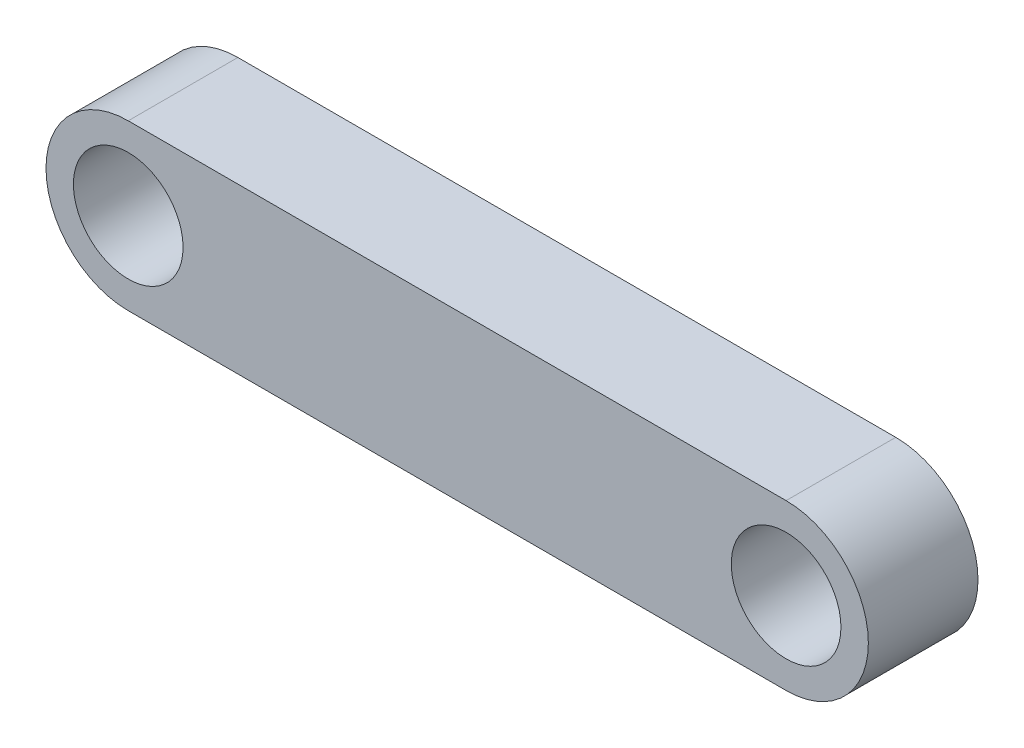
ISO-10303-21;
HEADER;
FILE_DESCRIPTION(('STEP AP214'),'2;1');
FILE_NAME('part.step','',(''),(''),'','','');
FILE_SCHEMA(('AUTOMOTIVE_DESIGN { 1 0 10303 214 1 1 1 1 }'));
ENDSEC;
DATA;
#1=APPLICATION_CONTEXT('core data for automotive mechanical design processes');
#2=APPLICATION_PROTOCOL_DEFINITION('international standard','automotive_design',2000,#1);
#3=PRODUCT_CONTEXT('',#1,'mechanical');
#4=PRODUCT('Part','Part','',(#3));
#5=PRODUCT_RELATED_PRODUCT_CATEGORY('part','',(#4));
#6=PRODUCT_DEFINITION_FORMATION('','',#4);
#7=PRODUCT_DEFINITION_CONTEXT('part definition',#1,'design');
#8=PRODUCT_DEFINITION('design','',#6,#7);
#9=PRODUCT_DEFINITION_SHAPE('','',#8);
#10=(LENGTH_UNIT() NAMED_UNIT(*) SI_UNIT(.MILLI.,.METRE.));
#11=(NAMED_UNIT(*) PLANE_ANGLE_UNIT() SI_UNIT($,.RADIAN.));
#12=(NAMED_UNIT(*) SI_UNIT($,.STERADIAN.) SOLID_ANGLE_UNIT());
#13=UNCERTAINTY_MEASURE_WITH_UNIT(LENGTH_MEASURE(1.E-05),#10,'distance_accuracy_value','');
#14=(GEOMETRIC_REPRESENTATION_CONTEXT(3) GLOBAL_UNCERTAINTY_ASSIGNED_CONTEXT((#13)) GLOBAL_UNIT_ASSIGNED_CONTEXT((#10,
#11,#12)) REPRESENTATION_CONTEXT('',''));
#15=CARTESIAN_POINT('',(0.,0.,0.));
#16=DIRECTION('',(0.,0.,1.));
#17=DIRECTION('',(1.,0.,0.));
#18=AXIS2_PLACEMENT_3D('',#15,#16,#17);
#19=CARTESIAN_POINT('',(0.,0.,10.));
#20=DIRECTION('',(0.,0.,1.));
#21=DIRECTION('',(1.,0.,0.));
#22=AXIS2_PLACEMENT_3D('',#19,#20,#21);
#23=PLANE('',#22);
#24=CARTESIAN_POINT('',(0.,0.,10.));
#25=DIRECTION('',(0.,0.,1.));
#26=DIRECTION('',(1.,0.,0.));
#27=AXIS2_PLACEMENT_3D('',#24,#25,#26);
#28=CIRCLE('',#27,5.);
#29=CARTESIAN_POINT('',(5.,0.,10.));
#30=VERTEX_POINT('',#29);
#31=EDGE_CURVE('E118',#30,#30,#28,.T.);
#32=ORIENTED_EDGE('',*,*,#31,.F.);
#33=EDGE_LOOP('',(#32));
#34=FACE_BOUND('',#33,.T.);
#35=CARTESIAN_POINT('',(0.,0.,10.));
#36=DIRECTION('',(0.,0.,1.));
#37=DIRECTION('',(1.,0.,0.));
#38=AXIS2_PLACEMENT_3D('',#35,#36,#37);
#39=CIRCLE('',#38,7.5);
#40=CARTESIAN_POINT('',(0.,7.5,10.));
#41=VERTEX_POINT('',#40);
#42=CARTESIAN_POINT('',(0.,-7.5,10.));
#43=VERTEX_POINT('',#42);
#44=EDGE_CURVE('E98',#41,#43,#39,.T.);
#45=ORIENTED_EDGE('',*,*,#44,.T.);
#46=DIRECTION('',(1.,0.,0.));
#47=VECTOR('',#46,1.);
#48=CARTESIAN_POINT('',(0.,-7.5,10.));
#49=LINE('',#48,#47);
#50=CARTESIAN_POINT('',(60.,-7.5,10.));
#51=VERTEX_POINT('',#50);
#52=EDGE_CURVE('E93',#43,#51,#49,.T.);
#53=ORIENTED_EDGE('',*,*,#52,.T.);
#54=CARTESIAN_POINT('',(60.,0.,10.));
#55=DIRECTION('',(0.,0.,1.));
#56=DIRECTION('',(1.,0.,0.));
#57=AXIS2_PLACEMENT_3D('',#54,#55,#56);
#58=CIRCLE('',#57,7.5);
#59=CARTESIAN_POINT('',(60.,7.5,10.));
#60=VERTEX_POINT('',#59);
#61=EDGE_CURVE('E96',#51,#60,#58,.T.);
#62=ORIENTED_EDGE('',*,*,#61,.T.);
#63=DIRECTION('',(-1.,0.,0.));
#64=VECTOR('',#63,1.);
#65=CARTESIAN_POINT('',(0.,7.5,10.));
#66=LINE('',#65,#64);
#67=EDGE_CURVE('E63',#60,#41,#66,.T.);
#68=ORIENTED_EDGE('',*,*,#67,.T.);
#69=EDGE_LOOP('',(#45,#53,#62,#68));
#70=FACE_BOUND('',#69,.T.);
#71=CARTESIAN_POINT('',(60.,0.,10.));
#72=DIRECTION('',(0.,0.,1.));
#73=DIRECTION('',(1.,0.,0.));
#74=AXIS2_PLACEMENT_3D('',#71,#72,#73);
#75=CIRCLE('',#74,5.);
#76=CARTESIAN_POINT('',(65.,0.,10.));
#77=VERTEX_POINT('',#76);
#78=EDGE_CURVE('E140',#77,#77,#75,.T.);
#79=ORIENTED_EDGE('',*,*,#78,.F.);
#80=EDGE_LOOP('',(#79));
#81=FACE_BOUND('',#80,.T.);
#82=ADVANCED_FACE('F45',(#34,#70,#81),#23,.T.);
#83=CARTESIAN_POINT('',(0.,0.,0.));
#84=DIRECTION('',(0.,0.,1.));
#85=DIRECTION('',(1.,0.,0.));
#86=AXIS2_PLACEMENT_3D('',#83,#84,#85);
#87=PLANE('',#86);
#88=CARTESIAN_POINT('',(0.,0.,0.));
#89=DIRECTION('',(0.,0.,1.));
#90=DIRECTION('',(1.,0.,0.));
#91=AXIS2_PLACEMENT_3D('',#88,#89,#90);
#92=CIRCLE('',#91,7.5);
#93=CARTESIAN_POINT('',(0.,7.5,0.));
#94=VERTEX_POINT('',#93);
#95=CARTESIAN_POINT('',(0.,-7.5,0.));
#96=VERTEX_POINT('',#95);
#97=EDGE_CURVE('E114',#94,#96,#92,.T.);
#98=ORIENTED_EDGE('',*,*,#97,.F.);
#99=DIRECTION('',(-1.,0.,0.));
#100=VECTOR('',#99,1.);
#101=CARTESIAN_POINT('',(0.,7.5,0.));
#102=LINE('',#101,#100);
#103=CARTESIAN_POINT('',(60.,7.5,0.));
#104=VERTEX_POINT('',#103);
#105=EDGE_CURVE('E86',#104,#94,#102,.T.);
#106=ORIENTED_EDGE('',*,*,#105,.F.);
#107=CARTESIAN_POINT('',(60.,0.,0.));
#108=DIRECTION('',(0.,0.,1.));
#109=DIRECTION('',(1.,0.,0.));
#110=AXIS2_PLACEMENT_3D('',#107,#108,#109);
#111=CIRCLE('',#110,7.5);
#112=CARTESIAN_POINT('',(60.,-7.5,0.));
#113=VERTEX_POINT('',#112);
#114=EDGE_CURVE('E80',#113,#104,#111,.T.);
#115=ORIENTED_EDGE('',*,*,#114,.F.);
#116=DIRECTION('',(1.,0.,0.));
#117=VECTOR('',#116,1.);
#118=CARTESIAN_POINT('',(0.,-7.5,0.));
#119=LINE('',#118,#117);
#120=EDGE_CURVE('E103',#96,#113,#119,.T.);
#121=ORIENTED_EDGE('',*,*,#120,.F.);
#122=EDGE_LOOP('',(#98,#106,#115,#121));
#123=FACE_BOUND('',#122,.T.);
#124=CARTESIAN_POINT('',(0.,0.,0.));
#125=DIRECTION('',(0.,0.,1.));
#126=DIRECTION('',(1.,0.,0.));
#127=AXIS2_PLACEMENT_3D('',#124,#125,#126);
#128=CIRCLE('',#127,5.);
#129=CARTESIAN_POINT('',(5.,0.,0.));
#130=VERTEX_POINT('',#129);
#131=EDGE_CURVE('E136',#130,#130,#128,.T.);
#132=ORIENTED_EDGE('',*,*,#131,.T.);
#133=EDGE_LOOP('',(#132));
#134=FACE_BOUND('',#133,.T.);
#135=CARTESIAN_POINT('',(60.,0.,0.));
#136=DIRECTION('',(0.,0.,1.));
#137=DIRECTION('',(1.,0.,0.));
#138=AXIS2_PLACEMENT_3D('',#135,#136,#137);
#139=CIRCLE('',#138,5.);
#140=CARTESIAN_POINT('',(65.,0.,0.));
#141=VERTEX_POINT('',#140);
#142=EDGE_CURVE('E144',#141,#141,#139,.T.);
#143=ORIENTED_EDGE('',*,*,#142,.T.);
#144=EDGE_LOOP('',(#143));
#145=FACE_BOUND('',#144,.T.);
#146=ADVANCED_FACE('F131',(#123,#134,#145),#87,.F.);
#147=CARTESIAN_POINT('',(0.,0.,10.));
#148=DIRECTION('',(0.,0.,-1.));
#149=DIRECTION('',(-1.,0.,0.));
#150=AXIS2_PLACEMENT_3D('',#147,#148,#149);
#151=CYLINDRICAL_SURFACE('',#150,7.5);
#152=ORIENTED_EDGE('',*,*,#97,.T.);
#153=DIRECTION('',(0.,0.,-1.));
#154=VECTOR('',#153,1.);
#155=CARTESIAN_POINT('',(0.,-7.5,10.));
#156=LINE('',#155,#154);
#157=EDGE_CURVE('E11',#43,#96,#156,.T.);
#158=ORIENTED_EDGE('',*,*,#157,.F.);
#159=ORIENTED_EDGE('',*,*,#44,.F.);
#160=DIRECTION('',(0.,0.,-1.));
#161=VECTOR('',#160,1.);
#162=CARTESIAN_POINT('',(0.,7.5,10.));
#163=LINE('',#162,#161);
#164=EDGE_CURVE('E110',#41,#94,#163,.T.);
#165=ORIENTED_EDGE('',*,*,#164,.T.);
#166=EDGE_LOOP('',(#152,#158,#159,#165));
#167=FACE_BOUND('',#166,.T.);
#168=ADVANCED_FACE('F47',(#167),#151,.T.);
#169=CARTESIAN_POINT('',(0.,-7.5,10.));
#170=DIRECTION('',(0.,1.,0.));
#171=DIRECTION('',(0.,0.,1.));
#172=AXIS2_PLACEMENT_3D('',#169,#170,#171);
#173=PLANE('',#172);
#174=ORIENTED_EDGE('',*,*,#120,.T.);
#175=DIRECTION('',(0.,0.,-1.));
#176=VECTOR('',#175,1.);
#177=CARTESIAN_POINT('',(60.,-7.5,10.));
#178=LINE('',#177,#176);
#179=EDGE_CURVE('E55',#51,#113,#178,.T.);
#180=ORIENTED_EDGE('',*,*,#179,.F.);
#181=ORIENTED_EDGE('',*,*,#52,.F.);
#182=ORIENTED_EDGE('',*,*,#157,.T.);
#183=EDGE_LOOP('',(#174,#180,#181,#182));
#184=FACE_BOUND('',#183,.T.);
#185=ADVANCED_FACE('F102',(#184),#173,.F.);
#186=CARTESIAN_POINT('',(60.,0.,10.));
#187=DIRECTION('',(0.,0.,-1.));
#188=DIRECTION('',(-1.,0.,0.));
#189=AXIS2_PLACEMENT_3D('',#186,#187,#188);
#190=CYLINDRICAL_SURFACE('',#189,7.5);
#191=ORIENTED_EDGE('',*,*,#114,.T.);
#192=DIRECTION('',(0.,0.,-1.));
#193=VECTOR('',#192,1.);
#194=CARTESIAN_POINT('',(60.,7.5,10.));
#195=LINE('',#194,#193);
#196=EDGE_CURVE('E105',#60,#104,#195,.T.);
#197=ORIENTED_EDGE('',*,*,#196,.F.);
#198=ORIENTED_EDGE('',*,*,#61,.F.);
#199=ORIENTED_EDGE('',*,*,#179,.T.);
#200=EDGE_LOOP('',(#191,#197,#198,#199));
#201=FACE_BOUND('',#200,.T.);
#202=ADVANCED_FACE('F106',(#201),#190,.T.);
#203=CARTESIAN_POINT('',(0.,7.5,10.));
#204=DIRECTION('',(0.,-1.,0.));
#205=DIRECTION('',(0.,0.,-1.));
#206=AXIS2_PLACEMENT_3D('',#203,#204,#205);
#207=PLANE('',#206);
#208=ORIENTED_EDGE('',*,*,#105,.T.);
#209=ORIENTED_EDGE('',*,*,#164,.F.);
#210=ORIENTED_EDGE('',*,*,#67,.F.);
#211=ORIENTED_EDGE('',*,*,#196,.T.);
#212=EDGE_LOOP('',(#208,#209,#210,#211));
#213=FACE_BOUND('',#212,.T.);
#214=ADVANCED_FACE('F128',(#213),#207,.F.);
#215=CARTESIAN_POINT('',(0.,0.,10.));
#216=DIRECTION('',(0.,0.,-1.));
#217=DIRECTION('',(-1.,0.,0.));
#218=AXIS2_PLACEMENT_3D('',#215,#216,#217);
#219=CYLINDRICAL_SURFACE('',#218,5.);
#220=ORIENTED_EDGE('',*,*,#31,.T.);
#221=EDGE_LOOP('',(#220));
#222=FACE_BOUND('',#221,.T.);
#223=ORIENTED_EDGE('',*,*,#131,.F.);
#224=EDGE_LOOP('',(#223));
#225=FACE_BOUND('',#224,.T.);
#226=ADVANCED_FACE('F163',(#222,#225),#219,.F.);
#227=CARTESIAN_POINT('',(60.,0.,10.));
#228=DIRECTION('',(0.,0.,-1.));
#229=DIRECTION('',(-1.,0.,0.));
#230=AXIS2_PLACEMENT_3D('',#227,#228,#229);
#231=CYLINDRICAL_SURFACE('',#230,5.);
#232=ORIENTED_EDGE('',*,*,#78,.T.);
#233=EDGE_LOOP('',(#232));
#234=FACE_BOUND('',#233,.T.);
#235=ORIENTED_EDGE('',*,*,#142,.F.);
#236=EDGE_LOOP('',(#235));
#237=FACE_BOUND('',#236,.T.);
#238=ADVANCED_FACE('F152',(#234,#237),#231,.F.);
#239=CLOSED_SHELL('',(#82,#146,#168,#185,#202,#214,#226,#238));
#240=MANIFOLD_SOLID_BREP('B2',#239);
#241=ADVANCED_BREP_SHAPE_REPRESENTATION('',(#18,#240),#14);
#242=SHAPE_DEFINITION_REPRESENTATION(#9,#241);
ENDSEC;
END-ISO-10303-21;
